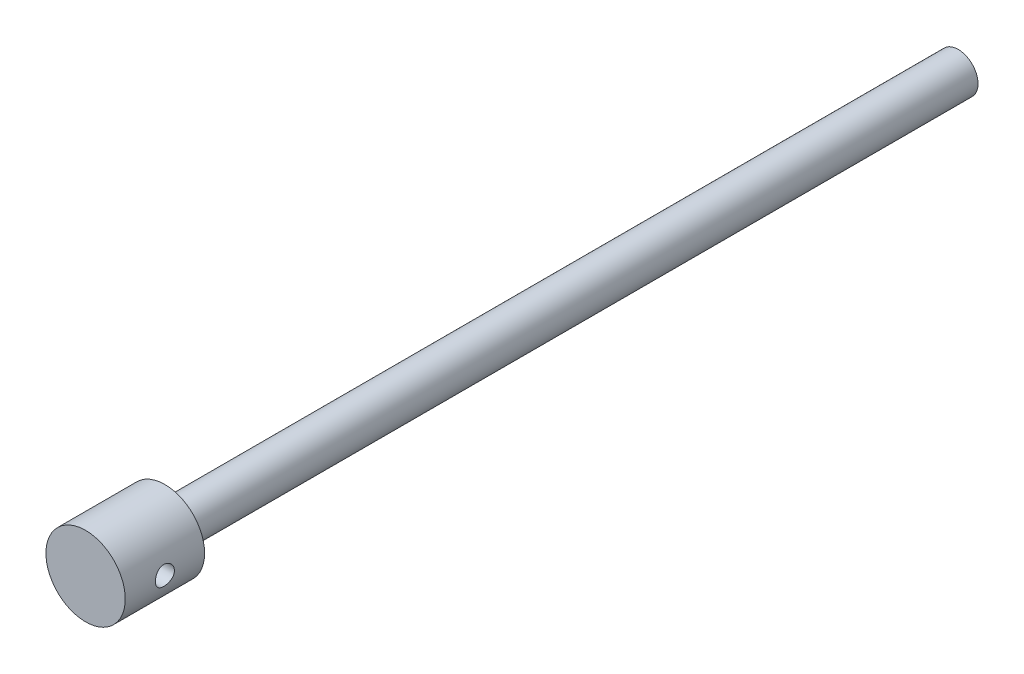
ISO-10303-21;
HEADER;
FILE_DESCRIPTION(('STEP AP214'),'2;1');
FILE_NAME('part.step','',(''),(''),'','','');
FILE_SCHEMA(('AUTOMOTIVE_DESIGN { 1 0 10303 214 1 1 1 1 }'));
ENDSEC;
DATA;
#1=APPLICATION_CONTEXT('core data for automotive mechanical design processes');
#2=APPLICATION_PROTOCOL_DEFINITION('international standard','automotive_design',2000,#1);
#3=PRODUCT_CONTEXT('',#1,'mechanical');
#4=PRODUCT('Part','Part','',(#3));
#5=PRODUCT_RELATED_PRODUCT_CATEGORY('part','',(#4));
#6=PRODUCT_DEFINITION_FORMATION('','',#4);
#7=PRODUCT_DEFINITION_CONTEXT('part definition',#1,'design');
#8=PRODUCT_DEFINITION('design','',#6,#7);
#9=PRODUCT_DEFINITION_SHAPE('','',#8);
#10=(LENGTH_UNIT() NAMED_UNIT(*) SI_UNIT(.MILLI.,.METRE.));
#11=(NAMED_UNIT(*) PLANE_ANGLE_UNIT() SI_UNIT($,.RADIAN.));
#12=(NAMED_UNIT(*) SI_UNIT($,.STERADIAN.) SOLID_ANGLE_UNIT());
#13=UNCERTAINTY_MEASURE_WITH_UNIT(LENGTH_MEASURE(1.E-05),#10,'distance_accuracy_value','');
#14=(GEOMETRIC_REPRESENTATION_CONTEXT(3) GLOBAL_UNCERTAINTY_ASSIGNED_CONTEXT((#13)) GLOBAL_UNIT_ASSIGNED_CONTEXT((#10,
#11,#12)) REPRESENTATION_CONTEXT('',''));
#15=CARTESIAN_POINT('',(0.,0.,0.));
#16=DIRECTION('',(0.,0.,1.));
#17=DIRECTION('',(1.,0.,0.));
#18=AXIS2_PLACEMENT_3D('',#15,#16,#17);
#19=CARTESIAN_POINT('',(0.,0.,25.));
#20=DIRECTION('',(0.,0.,-1.));
#21=DIRECTION('',(-1.,0.,0.));
#22=AXIS2_PLACEMENT_3D('',#19,#20,#21);
#23=CYLINDRICAL_SURFACE('',#22,25.);
#24=CARTESIAN_POINT('',(-25.,0.,6.));
#25=CARTESIAN_POINT('',(-25.0000026804997,-0.166017736340745,6.00000456540214));
#26=CARTESIAN_POINT('',(-24.9983437383731,-0.331984064130571,5.99310833150993));
#27=CARTESIAN_POINT('',(-24.9917601768854,-0.662757375273785,5.96559099005264));
#28=CARTESIAN_POINT('',(-24.9868351457074,-0.827564209779564,5.9449681517169));
#29=CARTESIAN_POINT('',(-24.9738504635424,-1.15483168687375,5.89015358483256));
#30=CARTESIAN_POINT('',(-24.9657897007271,-1.31729147606247,5.85595704340296));
#31=CARTESIAN_POINT('',(-24.9467537443302,-1.63872050759381,5.77426192077009));
#32=CARTESIAN_POINT('',(-24.9357774773038,-1.79768844089951,5.72675843979918));
#33=CARTESIAN_POINT('',(-24.9112316091515,-2.11072366381165,5.61891540003723));
#34=CARTESIAN_POINT('',(-24.897666030887,-2.26479812859839,5.55859573676267));
#35=CARTESIAN_POINT('',(-24.8682925860487,-2.56731972417304,5.42551265040053));
#36=CARTESIAN_POINT('',(-24.8524838922068,-2.71576475309531,5.35274463427505));
#37=CARTESIAN_POINT('',(-24.8190587739081,-3.00593509691774,5.19534290944832));
#38=CARTESIAN_POINT('',(-24.8014430394569,-3.14766294672407,5.11071372536087));
#39=CARTESIAN_POINT('',(-24.7648612187919,-3.42359889441685,4.93012876019096));
#40=CARTESIAN_POINT('',(-24.7458946268123,-3.55780414185136,4.83416872785933));
#41=CARTESIAN_POINT('',(-24.7067947855154,-3.81996752921303,4.62989450043683));
#42=CARTESIAN_POINT('',(-24.6866473068088,-3.94778319107671,4.52140013768632));
#43=CARTESIAN_POINT('',(-24.6460277155742,-4.19391043753479,4.29408764587841));
#44=CARTESIAN_POINT('',(-24.6255554853983,-4.31221847908384,4.17526570223456));
#45=CARTESIAN_POINT('',(-24.5848634527513,-4.53846894982133,3.92814913584833));
#46=CARTESIAN_POINT('',(-24.5646435856504,-4.64641408237687,3.79985699912307));
#47=CARTESIAN_POINT('',(-24.5250062264423,-4.85128465634762,3.53456313288754));
#48=CARTESIAN_POINT('',(-24.5055890332168,-4.94820601608992,3.39755820645565));
#49=CARTESIAN_POINT('',(-24.4678652790419,-5.1315149308875,3.11391094124512));
#50=CARTESIAN_POINT('',(-24.4495768107614,-5.21774615640803,2.96716507855242));
#51=CARTESIAN_POINT('',(-24.4149279468241,-5.37754406139993,2.66664581728528));
#52=CARTESIAN_POINT('',(-24.3985682798489,-5.45110595933349,2.51286979304049));
#53=CARTESIAN_POINT('',(-24.3682865029779,-5.58492026214268,2.1994677660297));
#54=CARTESIAN_POINT('',(-24.354363211339,-5.64517912327471,2.03984464503928));
#55=CARTESIAN_POINT('',(-24.3293636773731,-5.75195806967358,1.71585287452541));
#56=CARTESIAN_POINT('',(-24.318288457803,-5.79847322039683,1.55148254375859));
#57=CARTESIAN_POINT('',(-24.2902598679583,-5.91523377010968,1.05919919583858));
#58=CARTESIAN_POINT('',(-24.2778811042379,-5.96534620186162,0.725874749113898));
#59=CARTESIAN_POINT('',(-24.2697663322526,-5.99819895021148,0.223524398243799));
#60=CARTESIAN_POINT('',(-24.2688053008257,-6.00209048242323,0.0556145126310111));
#61=CARTESIAN_POINT('',(-24.2703574949623,-5.99581246294926,-0.279946661259358));
#62=CARTESIAN_POINT('',(-24.2728707591485,-5.98564275494965,-0.44759794664143));
#63=CARTESIAN_POINT('',(-24.285368999466,-5.93483975630032,-0.94076456203569));
#64=CARTESIAN_POINT('',(-24.3001939850224,-5.87440247397774,-1.26433890736987));
#65=CARTESIAN_POINT('',(-24.3412549446464,-5.70184242669472,-1.89644485976108));
#66=CARTESIAN_POINT('',(-24.3674916745551,-5.58971623816142,-2.20497546891141));
#67=CARTESIAN_POINT('',(-24.4286958367201,-5.3158825349441,-2.80181231169429));
#68=CARTESIAN_POINT('',(-24.4637429965247,-5.15371899452584,-3.08990124638672));
#69=CARTESIAN_POINT('',(-24.5385748778448,-4.78473374953622,-3.63521266148594));
#70=CARTESIAN_POINT('',(-24.5783603675971,-4.57790479882186,-3.89243012301656));
#71=CARTESIAN_POINT('',(-24.6594640880418,-4.11902988641842,-4.37578612219122));
#72=CARTESIAN_POINT('',(-24.7007951674045,-3.86594129003371,-4.60093392530014));
#73=CARTESIAN_POINT('',(-24.7793903091839,-3.32511184695822,-5.00576971232414));
#74=CARTESIAN_POINT('',(-24.8166542657671,-3.03737009894219,-5.18545651342569));
#75=CARTESIAN_POINT('',(-24.8830789940348,-2.43405695507431,-5.49459436816912));
#76=CARTESIAN_POINT('',(-24.9122154123614,-2.11840557448716,-5.62389489426828));
#77=CARTESIAN_POINT('',(-24.9589240940734,-1.46899521159138,-5.82733017630127));
#78=CARTESIAN_POINT('',(-24.9764983913503,-1.13523942521408,-5.90147463503288));
#79=CARTESIAN_POINT('',(-24.9978055089126,-0.467574800827574,-5.9910041295196));
#80=CARTESIAN_POINT('',(-25.0018564268946,-0.133856966575297,-6.00773980312667));
#81=CARTESIAN_POINT('',(-24.9965614831509,0.531608768658087,-5.98566644809618));
#82=CARTESIAN_POINT('',(-24.9872167270307,0.86335682994432,-5.94686200343595));
#83=CARTESIAN_POINT('',(-24.9563832816127,1.51084514007902,-5.81592611457634));
#84=CARTESIAN_POINT('',(-24.9350603275565,1.82674108394961,-5.72452204764071));
#85=CARTESIAN_POINT('',(-24.8826669936479,2.43870667494971,-5.49180334979549));
#86=CARTESIAN_POINT('',(-24.8515956762951,2.73477441187556,-5.35048391835943));
#87=CARTESIAN_POINT('',(-24.7823820658762,3.30412273668564,-5.01926782504765));
#88=CARTESIAN_POINT('',(-24.7441307708391,3.57694246966835,-4.82860237303103));
#89=CARTESIAN_POINT('',(-24.6649871461435,4.08719914724014,-4.40508233449032));
#90=CARTESIAN_POINT('',(-24.6240943990595,4.32463047973872,-4.17222106926478));
#91=CARTESIAN_POINT('',(-24.5431489449983,4.76284500809666,-3.66473287585825));
#92=CARTESIAN_POINT('',(-24.5031358001301,4.96268414096836,-3.38928458208874));
#93=CARTESIAN_POINT('',(-24.4295058119813,5.31333575577367,-2.80776432040893));
#94=CARTESIAN_POINT('',(-24.395888682328,5.46415043292342,-2.50169372450633));
#95=CARTESIAN_POINT('',(-24.353347630646,5.64963439053452,-2.02740631601414));
#96=CARTESIAN_POINT('',(-24.3405033891164,5.70458710242878,-1.86719304338546));
#97=CARTESIAN_POINT('',(-24.3177552029261,5.80079732294279,-1.54251797996795));
#98=CARTESIAN_POINT('',(-24.3078501521252,5.84205998439172,-1.37805781285673));
#99=CARTESIAN_POINT('',(-24.2912903166139,5.91053741786634,-1.04608209677075));
#100=CARTESIAN_POINT('',(-24.2846356373073,5.93775173433046,-0.878566448894801));
#101=CARTESIAN_POINT('',(-24.2747841701866,5.97789965204539,-0.541733533144882));
#102=CARTESIAN_POINT('',(-24.2715872278157,5.99083389159895,-0.372416346139201));
#103=CARTESIAN_POINT('',(-24.2687899616173,6.00215499594078,-0.0377512694881862));
#104=CARTESIAN_POINT('',(-24.2690968340135,6.00091722515411,0.127583284473569));
#105=CARTESIAN_POINT('',(-24.2730742483489,5.9848087278487,0.457543521934816));
#106=CARTESIAN_POINT('',(-24.2767447169658,5.96993829850501,0.622169220807877));
#107=CARTESIAN_POINT('',(-24.2873399112073,5.92668661056588,0.949554601566191));
#108=CARTESIAN_POINT('',(-24.294265147542,5.89830323162515,1.11231398649826));
#109=CARTESIAN_POINT('',(-24.3111608262961,5.82827196779405,1.4347302014815));
#110=CARTESIAN_POINT('',(-24.3211301931022,5.78662876790753,1.59438810625005));
#111=CARTESIAN_POINT('',(-24.3437686465433,5.69063662986335,1.90880751897123));
#112=CARTESIAN_POINT('',(-24.3564247302984,5.63634876916799,2.06358862718259));
#113=CARTESIAN_POINT('',(-24.3840980883562,5.51539707483437,2.36795338813921));
#114=CARTESIAN_POINT('',(-24.3991145400161,5.44873755154826,2.51753882959938));
#115=CARTESIAN_POINT('',(-24.4310987091682,5.30348427217981,2.81066216691562));
#116=CARTESIAN_POINT('',(-24.4480672900111,5.22488523075194,2.9541973483356));
#117=CARTESIAN_POINT('',(-24.4834782828489,5.05635243091258,3.23419114516889));
#118=CARTESIAN_POINT('',(-24.5019202059306,4.96642242689347,3.37065208351453));
#119=CARTESIAN_POINT('',(-24.5402505889388,4.77346921711415,3.63895038329228));
#120=CARTESIAN_POINT('',(-24.5601634300573,4.67017903544834,3.77059233112977));
#121=CARTESIAN_POINT('',(-24.600458146359,4.45304880482868,4.02470841849));
#122=CARTESIAN_POINT('',(-24.6208398586377,4.33921237965749,4.14718568112286));
#123=CARTESIAN_POINT('',(-24.661530300392,4.10164015488731,4.38229311298194));
#124=CARTESIAN_POINT('',(-24.6818389796797,3.97789855094998,4.49491742637743));
#125=CARTESIAN_POINT('',(-24.7218081005976,3.7214296777047,4.70944810475762));
#126=CARTESIAN_POINT('',(-24.7414687761375,3.58870570477298,4.81135836693313));
#127=CARTESIAN_POINT('',(-24.7799327781137,3.31280088827595,5.00542392249545));
#128=CARTESIAN_POINT('',(-24.7987162302532,3.16948213881107,5.09738724836247));
#129=CARTESIAN_POINT('',(-24.8345280560803,2.8754381763477,5.26885307228841));
#130=CARTESIAN_POINT('',(-24.8515570748485,2.72471571591034,5.3483601559727));
#131=CARTESIAN_POINT('',(-24.883375777664,2.41692354679156,5.49431228714753));
#132=CARTESIAN_POINT('',(-24.8981665133663,2.25985686316147,5.5607634733439));
#133=CARTESIAN_POINT('',(-24.9250921884147,1.94048744711081,5.68010427203911));
#134=CARTESIAN_POINT('',(-24.9372275530119,1.77818555787967,5.73299605627635));
#135=CARTESIAN_POINT('',(-24.9647957983314,1.35190448336007,5.85202517345409));
#136=CARTESIAN_POINT('',(-24.9779181465939,1.08469226075993,5.9074241484908));
#137=CARTESIAN_POINT('',(-24.9955177731159,0.544940331071897,5.98140664420594));
#138=CARTESIAN_POINT('',(-24.9999956018512,0.272400964328513,5.99999250911395));
#139=CARTESIAN_POINT('',(-25.,0.,6.));
#140=B_SPLINE_CURVE_WITH_KNOTS('',3,(#24,#25,#26,#27,#28,#29,#30,#31,#32,#33,#34,#35,#36,#37,
#38,#39,#40,#41,#42,#43,#44,#45,#46,#47,#48,#49,#50,#51,#52,#53,#54,#55,#56,#57,#58,#59,#60,#61,
#62,#63,#64,#65,#66,#67,#68,#69,#70,#71,#72,#73,#74,#75,#76,#77,#78,#79,#80,#81,#82,#83,#84,#85,
#86,#87,#88,#89,#90,#91,#92,#93,#94,#95,#96,#97,#98,#99,#100,#101,#102,#103,#104,#105,#106,#107,
#108,#109,#110,#111,#112,#113,#114,#115,#116,#117,#118,#119,#120,#121,#122,#123,#124,#125,#126,
#127,#128,#129,#130,#131,#132,#133,#134,#135,#136,#137,#138,#139),.UNSPECIFIED.,.T.,.F.,(4,2,2,
2,2,2,2,2,2,2,2,2,2,2,2,2,2,2,2,2,2,2,2,2,2,2,2,2,2,2,2,2,2,2,2,2,2,2,2,2,2,2,2,2,2,2,2,2,2,2,2,
2,2,2,2,2,2,4),(0.,0.497813360100955,0.995689500769748,1.49374233325073,1.99197879609469,
2.4894473877073,2.98709992652941,3.48456314269129,3.98221359994715,4.48820831908741,
4.99439073274951,5.50044073797177,6.00667750796929,6.5196119014362,7.03273945954076,
7.5456174354008,8.05867933189507,9.06463756237654,9.56800871792682,10.0713854693234,
11.0548629550303,12.0384055899336,13.0311908061742,14.0241372047509,15.0430966233895,
16.0620825507942,17.0840897493149,18.1059171185591,19.1035329919673,20.1010665323702,
21.085126203147,22.069280539993,23.0698021185097,24.0704821968969,25.0936623603892,
26.1167967016263,26.6258643414059,27.1347401541084,27.6436324676663,28.1525020334114,
28.6479253897995,29.1433379468293,29.6388282657176,30.1341437102249,30.6271145113295,
31.1199138801487,31.6129320389054,32.105787268885,32.6107272666003,33.1154944014541,
33.6205595212516,34.1254402854413,34.6387770201077,35.1519243293048,35.6648297831432,
36.177653036205,36.9945144051894,37.8113237554193),.UNSPECIFIED.);
#141=CARTESIAN_POINT('',(-25.,0.,6.));
#142=VERTEX_POINT('',#141);
#143=EDGE_CURVE('E39',#142,#142,#140,.T.);
#144=ORIENTED_EDGE('',*,*,#143,.T.);
#145=EDGE_LOOP('',(#144));
#146=FACE_BOUND('',#145,.T.);
#147=CARTESIAN_POINT('',(25.,0.,-6.));
#148=CARTESIAN_POINT('',(25.0000026804997,-0.166017736340745,-6.00000456540214));
#149=CARTESIAN_POINT('',(24.9983437383731,-0.331984064130571,-5.99310833150993));
#150=CARTESIAN_POINT('',(24.9917601768854,-0.662757375273785,-5.96559099005264));
#151=CARTESIAN_POINT('',(24.9868351457074,-0.827564209779564,-5.9449681517169));
#152=CARTESIAN_POINT('',(24.9738504635424,-1.15483168687375,-5.89015358483256));
#153=CARTESIAN_POINT('',(24.9657897007271,-1.31729147606247,-5.85595704340296));
#154=CARTESIAN_POINT('',(24.9467537443302,-1.63872050759381,-5.77426192077009));
#155=CARTESIAN_POINT('',(24.9357774773038,-1.79768844089951,-5.72675843979918));
#156=CARTESIAN_POINT('',(24.9112316091515,-2.11072366381165,-5.61891540003723));
#157=CARTESIAN_POINT('',(24.897666030887,-2.26479812859839,-5.55859573676267));
#158=CARTESIAN_POINT('',(24.8682925860487,-2.56731972417304,-5.42551265040053));
#159=CARTESIAN_POINT('',(24.8524838922068,-2.71576475309531,-5.35274463427505));
#160=CARTESIAN_POINT('',(24.8190587739081,-3.00593509691774,-5.19534290944832));
#161=CARTESIAN_POINT('',(24.8014430394569,-3.14766294672407,-5.11071372536087));
#162=CARTESIAN_POINT('',(24.7648612187919,-3.42359889441685,-4.93012876019096));
#163=CARTESIAN_POINT('',(24.7458946268123,-3.55780414185136,-4.83416872785933));
#164=CARTESIAN_POINT('',(24.7067947855154,-3.81996752921303,-4.62989450043683));
#165=CARTESIAN_POINT('',(24.6866473068088,-3.94778319107671,-4.52140013768632));
#166=CARTESIAN_POINT('',(24.6460277155742,-4.19391043753479,-4.29408764587841));
#167=CARTESIAN_POINT('',(24.6255554853983,-4.31221847908384,-4.17526570223456));
#168=CARTESIAN_POINT('',(24.5848634527513,-4.53846894982133,-3.92814913584833));
#169=CARTESIAN_POINT('',(24.5646435856504,-4.64641408237687,-3.79985699912307));
#170=CARTESIAN_POINT('',(24.5250062264423,-4.85128465634762,-3.53456313288754));
#171=CARTESIAN_POINT('',(24.5055890332168,-4.94820601608992,-3.39755820645565));
#172=CARTESIAN_POINT('',(24.4678652790419,-5.1315149308875,-3.11391094124512));
#173=CARTESIAN_POINT('',(24.4495768107614,-5.21774615640803,-2.96716507855242));
#174=CARTESIAN_POINT('',(24.4149279468241,-5.37754406139993,-2.66664581728528));
#175=CARTESIAN_POINT('',(24.3985682798489,-5.45110595933349,-2.51286979304049));
#176=CARTESIAN_POINT('',(24.3682865029779,-5.58492026214268,-2.1994677660297));
#177=CARTESIAN_POINT('',(24.354363211339,-5.64517912327471,-2.03984464503928));
#178=CARTESIAN_POINT('',(24.3293636773731,-5.75195806967358,-1.71585287452541));
#179=CARTESIAN_POINT('',(24.318288457803,-5.79847322039683,-1.55148254375859));
#180=CARTESIAN_POINT('',(24.2902598679583,-5.91523377010968,-1.05919919583858));
#181=CARTESIAN_POINT('',(24.2778811042379,-5.96534620186162,-0.725874749113898));
#182=CARTESIAN_POINT('',(24.2697663322526,-5.99819895021148,-0.223524398243799));
#183=CARTESIAN_POINT('',(24.2688053008257,-6.00209048242323,-0.0556145126310111));
#184=CARTESIAN_POINT('',(24.2703574949623,-5.99581246294926,0.279946661259358));
#185=CARTESIAN_POINT('',(24.2728707591485,-5.98564275494965,0.44759794664143));
#186=CARTESIAN_POINT('',(24.285368999466,-5.93483975630032,0.94076456203569));
#187=CARTESIAN_POINT('',(24.3001939850224,-5.87440247397774,1.26433890736987));
#188=CARTESIAN_POINT('',(24.3412549446464,-5.70184242669472,1.89644485976108));
#189=CARTESIAN_POINT('',(24.3674916745551,-5.58971623816142,2.20497546891141));
#190=CARTESIAN_POINT('',(24.4286958367201,-5.3158825349441,2.80181231169429));
#191=CARTESIAN_POINT('',(24.4637429965247,-5.15371899452584,3.08990124638672));
#192=CARTESIAN_POINT('',(24.5385748778448,-4.78473374953622,3.63521266148594));
#193=CARTESIAN_POINT('',(24.5783603675971,-4.57790479882186,3.89243012301656));
#194=CARTESIAN_POINT('',(24.6594640880418,-4.11902988641842,4.37578612219122));
#195=CARTESIAN_POINT('',(24.7007951674045,-3.86594129003371,4.60093392530014));
#196=CARTESIAN_POINT('',(24.7793903091839,-3.32511184695822,5.00576971232414));
#197=CARTESIAN_POINT('',(24.8166542657671,-3.03737009894219,5.18545651342569));
#198=CARTESIAN_POINT('',(24.8830789940348,-2.43405695507431,5.49459436816912));
#199=CARTESIAN_POINT('',(24.9122154123614,-2.11840557448716,5.62389489426828));
#200=CARTESIAN_POINT('',(24.9589240940734,-1.46899521159138,5.82733017630127));
#201=CARTESIAN_POINT('',(24.9764983913503,-1.13523942521408,5.90147463503288));
#202=CARTESIAN_POINT('',(24.9978055089126,-0.467574800827574,5.9910041295196));
#203=CARTESIAN_POINT('',(25.0018564268946,-0.133856966575297,6.00773980312667));
#204=CARTESIAN_POINT('',(24.9965614831509,0.531608768658087,5.98566644809618));
#205=CARTESIAN_POINT('',(24.9872167270307,0.86335682994432,5.94686200343595));
#206=CARTESIAN_POINT('',(24.9563832816127,1.51084514007902,5.81592611457634));
#207=CARTESIAN_POINT('',(24.9350603275565,1.82674108394961,5.72452204764071));
#208=CARTESIAN_POINT('',(24.8826669936479,2.43870667494971,5.49180334979549));
#209=CARTESIAN_POINT('',(24.8515956762951,2.73477441187556,5.35048391835943));
#210=CARTESIAN_POINT('',(24.7823820658762,3.30412273668564,5.01926782504765));
#211=CARTESIAN_POINT('',(24.7441307708391,3.57694246966835,4.82860237303103));
#212=CARTESIAN_POINT('',(24.6649871461435,4.08719914724014,4.40508233449032));
#213=CARTESIAN_POINT('',(24.6240943990595,4.32463047973872,4.17222106926478));
#214=CARTESIAN_POINT('',(24.5431489449983,4.76284500809666,3.66473287585825));
#215=CARTESIAN_POINT('',(24.5031358001301,4.96268414096836,3.38928458208874));
#216=CARTESIAN_POINT('',(24.4295058119813,5.31333575577367,2.80776432040893));
#217=CARTESIAN_POINT('',(24.395888682328,5.46415043292342,2.50169372450633));
#218=CARTESIAN_POINT('',(24.353347630646,5.64963439053452,2.02740631601414));
#219=CARTESIAN_POINT('',(24.3405033891164,5.70458710242878,1.86719304338546));
#220=CARTESIAN_POINT('',(24.3177552029261,5.80079732294279,1.54251797996795));
#221=CARTESIAN_POINT('',(24.3078501521252,5.84205998439172,1.37805781285673));
#222=CARTESIAN_POINT('',(24.2912903166139,5.91053741786634,1.04608209677075));
#223=CARTESIAN_POINT('',(24.2846356373073,5.93775173433046,0.878566448894801));
#224=CARTESIAN_POINT('',(24.2747841701866,5.97789965204539,0.541733533144882));
#225=CARTESIAN_POINT('',(24.2715872278157,5.99083389159895,0.372416346139201));
#226=CARTESIAN_POINT('',(24.2687899616173,6.00215499594078,0.0377512694881862));
#227=CARTESIAN_POINT('',(24.2690968340135,6.00091722515411,-0.127583284473569));
#228=CARTESIAN_POINT('',(24.2730742483489,5.9848087278487,-0.457543521934816));
#229=CARTESIAN_POINT('',(24.2767447169658,5.96993829850501,-0.622169220807877));
#230=CARTESIAN_POINT('',(24.2873399112073,5.92668661056588,-0.949554601566191));
#231=CARTESIAN_POINT('',(24.294265147542,5.89830323162515,-1.11231398649826));
#232=CARTESIAN_POINT('',(24.3111608262961,5.82827196779405,-1.4347302014815));
#233=CARTESIAN_POINT('',(24.3211301931022,5.78662876790753,-1.59438810625005));
#234=CARTESIAN_POINT('',(24.3437686465433,5.69063662986335,-1.90880751897123));
#235=CARTESIAN_POINT('',(24.3564247302984,5.63634876916799,-2.06358862718259));
#236=CARTESIAN_POINT('',(24.3840980883562,5.51539707483437,-2.36795338813921));
#237=CARTESIAN_POINT('',(24.3991145400161,5.44873755154826,-2.51753882959938));
#238=CARTESIAN_POINT('',(24.4310987091682,5.30348427217981,-2.81066216691562));
#239=CARTESIAN_POINT('',(24.4480672900111,5.22488523075194,-2.9541973483356));
#240=CARTESIAN_POINT('',(24.4834782828489,5.05635243091258,-3.23419114516889));
#241=CARTESIAN_POINT('',(24.5019202059306,4.96642242689347,-3.37065208351453));
#242=CARTESIAN_POINT('',(24.5402505889388,4.77346921711415,-3.63895038329228));
#243=CARTESIAN_POINT('',(24.5601634300573,4.67017903544834,-3.77059233112977));
#244=CARTESIAN_POINT('',(24.600458146359,4.45304880482868,-4.02470841849));
#245=CARTESIAN_POINT('',(24.6208398586377,4.33921237965749,-4.14718568112286));
#246=CARTESIAN_POINT('',(24.661530300392,4.10164015488731,-4.38229311298194));
#247=CARTESIAN_POINT('',(24.6818389796797,3.97789855094998,-4.49491742637743));
#248=CARTESIAN_POINT('',(24.7218081005976,3.7214296777047,-4.70944810475762));
#249=CARTESIAN_POINT('',(24.7414687761375,3.58870570477298,-4.81135836693313));
#250=CARTESIAN_POINT('',(24.7799327781137,3.31280088827595,-5.00542392249545));
#251=CARTESIAN_POINT('',(24.7987162302532,3.16948213881107,-5.09738724836247));
#252=CARTESIAN_POINT('',(24.8345280560803,2.8754381763477,-5.26885307228841));
#253=CARTESIAN_POINT('',(24.8515570748485,2.72471571591034,-5.3483601559727));
#254=CARTESIAN_POINT('',(24.883375777664,2.41692354679156,-5.49431228714753));
#255=CARTESIAN_POINT('',(24.8981665133663,2.25985686316147,-5.5607634733439));
#256=CARTESIAN_POINT('',(24.9250921884147,1.94048744711081,-5.68010427203911));
#257=CARTESIAN_POINT('',(24.9372275530119,1.77818555787967,-5.73299605627635));
#258=CARTESIAN_POINT('',(24.9647957983314,1.35190448336007,-5.85202517345409));
#259=CARTESIAN_POINT('',(24.9779181465939,1.08469226075993,-5.9074241484908));
#260=CARTESIAN_POINT('',(24.9955177731159,0.544940331071897,-5.98140664420594));
#261=CARTESIAN_POINT('',(24.9999956018512,0.272400964328513,-5.99999250911395));
#262=CARTESIAN_POINT('',(25.,0.,-6.));
#263=B_SPLINE_CURVE_WITH_KNOTS('',3,(#147,#148,#149,#150,#151,#152,#153,#154,#155,#156,#157,
#158,#159,#160,#161,#162,#163,#164,#165,#166,#167,#168,#169,#170,#171,#172,#173,#174,#175,#176,
#177,#178,#179,#180,#181,#182,#183,#184,#185,#186,#187,#188,#189,#190,#191,#192,#193,#194,#195,
#196,#197,#198,#199,#200,#201,#202,#203,#204,#205,#206,#207,#208,#209,#210,#211,#212,#213,#214,
#215,#216,#217,#218,#219,#220,#221,#222,#223,#224,#225,#226,#227,#228,#229,#230,#231,#232,#233,
#234,#235,#236,#237,#238,#239,#240,#241,#242,#243,#244,#245,#246,#247,#248,#249,#250,#251,#252,
#253,#254,#255,#256,#257,#258,#259,#260,#261,#262),.UNSPECIFIED.,.T.,.F.,(4,2,2,2,2,2,2,2,2,2,2,
2,2,2,2,2,2,2,2,2,2,2,2,2,2,2,2,2,2,2,2,2,2,2,2,2,2,2,2,2,2,2,2,2,2,2,2,2,2,2,2,2,2,2,2,2,2,4),
(0.,0.497813360100955,0.995689500769748,1.49374233325073,1.99197879609469,2.4894473877073,
2.98709992652941,3.48456314269129,3.98221359994715,4.48820831908741,4.99439073274951,
5.50044073797177,6.00667750796929,6.5196119014362,7.03273945954076,7.5456174354008,
8.05867933189507,9.06463756237654,9.56800871792682,10.0713854693234,11.0548629550303,
12.0384055899336,13.0311908061742,14.0241372047509,15.0430966233895,16.0620825507942,
17.0840897493149,18.1059171185591,19.1035329919673,20.1010665323702,21.085126203147,
22.069280539993,23.0698021185097,24.0704821968969,25.0936623603892,26.1167967016263,
26.6258643414059,27.1347401541084,27.6436324676663,28.1525020334114,28.6479253897995,
29.1433379468293,29.6388282657176,30.1341437102249,30.6271145113295,31.1199138801487,
31.6129320389054,32.105787268885,32.6107272666003,33.1154944014541,33.6205595212516,
34.1254402854413,34.6387770201077,35.1519243293048,35.6648297831432,36.177653036205,
36.9945144051894,37.8113237554193),.UNSPECIFIED.);
#264=CARTESIAN_POINT('',(25.,0.,-6.));
#265=VERTEX_POINT('',#264);
#266=EDGE_CURVE('E58',#265,#265,#263,.T.);
#267=ORIENTED_EDGE('',*,*,#266,.T.);
#268=EDGE_LOOP('',(#267));
#269=FACE_BOUND('',#268,.T.);
#270=CARTESIAN_POINT('',(0.,0.,25.));
#271=DIRECTION('',(0.,0.,1.));
#272=DIRECTION('',(1.,0.,0.));
#273=AXIS2_PLACEMENT_3D('',#270,#271,#272);
#274=CIRCLE('',#273,25.);
#275=CARTESIAN_POINT('',(25.,0.,25.));
#276=VERTEX_POINT('',#275);
#277=EDGE_CURVE('E47',#276,#276,#274,.T.);
#278=ORIENTED_EDGE('',*,*,#277,.F.);
#279=EDGE_LOOP('',(#278));
#280=FACE_BOUND('',#279,.T.);
#281=CARTESIAN_POINT('',(0.,0.,-25.));
#282=DIRECTION('',(0.,0.,1.));
#283=DIRECTION('',(1.,0.,0.));
#284=AXIS2_PLACEMENT_3D('',#281,#282,#283);
#285=CIRCLE('',#284,25.);
#286=CARTESIAN_POINT('',(25.,0.,-25.));
#287=VERTEX_POINT('',#286);
#288=EDGE_CURVE('E52',#287,#287,#285,.T.);
#289=ORIENTED_EDGE('',*,*,#288,.T.);
#290=EDGE_LOOP('',(#289));
#291=FACE_BOUND('',#290,.T.);
#292=ADVANCED_FACE('F35',(#146,#269,#280,#291),#23,.T.);
#293=CARTESIAN_POINT('',(0.,0.,25.));
#294=DIRECTION('',(0.,0.,1.));
#295=DIRECTION('',(1.,0.,0.));
#296=AXIS2_PLACEMENT_3D('',#293,#294,#295);
#297=PLANE('',#296);
#298=ORIENTED_EDGE('',*,*,#277,.T.);
#299=EDGE_LOOP('',(#298));
#300=FACE_BOUND('',#299,.T.);
#301=ADVANCED_FACE('F72',(#300),#297,.T.);
#302=CARTESIAN_POINT('',(0.,0.,-25.));
#303=DIRECTION('',(0.,0.,1.));
#304=DIRECTION('',(1.,0.,0.));
#305=AXIS2_PLACEMENT_3D('',#302,#303,#304);
#306=PLANE('',#305);
#307=CARTESIAN_POINT('',(0.,0.,-25.));
#308=DIRECTION('',(0.,0.,-1.));
#309=DIRECTION('',(-1.,0.,0.));
#310=AXIS2_PLACEMENT_3D('',#307,#308,#309);
#311=CIRCLE('',#310,12.5);
#312=CARTESIAN_POINT('',(-12.5,0.,-25.));
#313=VERTEX_POINT('',#312);
#314=EDGE_CURVE('E10',#313,#313,#311,.T.);
#315=ORIENTED_EDGE('',*,*,#314,.F.);
#316=EDGE_LOOP('',(#315));
#317=FACE_BOUND('',#316,.T.);
#318=ORIENTED_EDGE('',*,*,#288,.F.);
#319=EDGE_LOOP('',(#318));
#320=FACE_BOUND('',#319,.T.);
#321=ADVANCED_FACE('F69',(#317,#320),#306,.F.);
#322=CARTESIAN_POINT('',(-35.,0.,0.));
#323=DIRECTION('',(1.,0.,0.));
#324=DIRECTION('',(0.,0.,-1.));
#325=AXIS2_PLACEMENT_3D('',#322,#323,#324);
#326=CYLINDRICAL_SURFACE('',#325,6.);
#327=ORIENTED_EDGE('',*,*,#266,.F.);
#328=EDGE_LOOP('',(#327));
#329=FACE_BOUND('',#328,.T.);
#330=ORIENTED_EDGE('',*,*,#143,.F.);
#331=EDGE_LOOP('',(#330));
#332=FACE_BOUND('',#331,.T.);
#333=ADVANCED_FACE('F63',(#329,#332),#326,.F.);
#334=CARTESIAN_POINT('',(0.,0.,-525.));
#335=DIRECTION('',(0.,0.,1.));
#336=DIRECTION('',(1.,0.,0.));
#337=AXIS2_PLACEMENT_3D('',#334,#335,#336);
#338=CYLINDRICAL_SURFACE('',#337,12.5);
#339=CARTESIAN_POINT('',(0.,0.,-525.));
#340=DIRECTION('',(0.,0.,-1.));
#341=DIRECTION('',(-1.,0.,0.));
#342=AXIS2_PLACEMENT_3D('',#339,#340,#341);
#343=CIRCLE('',#342,12.5);
#344=CARTESIAN_POINT('',(-12.5,0.,-525.));
#345=VERTEX_POINT('',#344);
#346=EDGE_CURVE('E55',#345,#345,#343,.T.);
#347=ORIENTED_EDGE('',*,*,#346,.F.);
#348=EDGE_LOOP('',(#347));
#349=FACE_BOUND('',#348,.T.);
#350=ORIENTED_EDGE('',*,*,#314,.T.);
#351=EDGE_LOOP('',(#350));
#352=FACE_BOUND('',#351,.T.);
#353=ADVANCED_FACE('F68',(#349,#352),#338,.T.);
#354=CARTESIAN_POINT('',(0.,0.,-525.));
#355=DIRECTION('',(0.,0.,-1.));
#356=DIRECTION('',(-1.,0.,0.));
#357=AXIS2_PLACEMENT_3D('',#354,#355,#356);
#358=PLANE('',#357);
#359=ORIENTED_EDGE('',*,*,#346,.T.);
#360=EDGE_LOOP('',(#359));
#361=FACE_BOUND('',#360,.T.);
#362=ADVANCED_FACE('F120',(#361),#358,.T.);
#363=CLOSED_SHELL('',(#292,#301,#321,#333,#353,#362));
#364=MANIFOLD_SOLID_BREP('B2',#363);
#365=ADVANCED_BREP_SHAPE_REPRESENTATION('',(#18,#364),#14);
#366=SHAPE_DEFINITION_REPRESENTATION(#9,#365);
ENDSEC;
END-ISO-10303-21;
